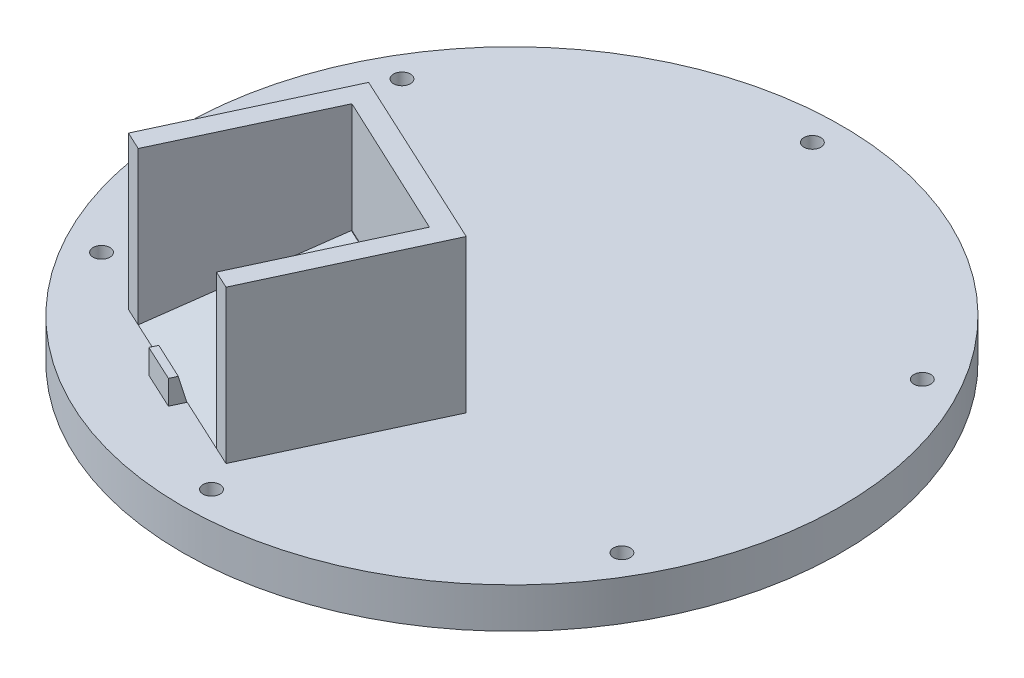
ISO-10303-21;
HEADER;
FILE_DESCRIPTION(('STEP AP214'),'2;1');
FILE_NAME('part.step','',(''),(''),'','','');
FILE_SCHEMA(('AUTOMOTIVE_DESIGN { 1 0 10303 214 1 1 1 1 }'));
ENDSEC;
DATA;
#1=APPLICATION_CONTEXT('core data for automotive mechanical design processes');
#2=APPLICATION_PROTOCOL_DEFINITION('international standard','automotive_design',2000,#1);
#3=PRODUCT_CONTEXT('',#1,'mechanical');
#4=PRODUCT('Part','Part','',(#3));
#5=PRODUCT_RELATED_PRODUCT_CATEGORY('part','',(#4));
#6=PRODUCT_DEFINITION_FORMATION('','',#4);
#7=PRODUCT_DEFINITION_CONTEXT('part definition',#1,'design');
#8=PRODUCT_DEFINITION('design','',#6,#7);
#9=PRODUCT_DEFINITION_SHAPE('','',#8);
#10=(LENGTH_UNIT() NAMED_UNIT(*) SI_UNIT(.MILLI.,.METRE.));
#11=(NAMED_UNIT(*) PLANE_ANGLE_UNIT() SI_UNIT($,.RADIAN.));
#12=(NAMED_UNIT(*) SI_UNIT($,.STERADIAN.) SOLID_ANGLE_UNIT());
#13=UNCERTAINTY_MEASURE_WITH_UNIT(LENGTH_MEASURE(1.E-05),#10,'distance_accuracy_value','');
#14=(GEOMETRIC_REPRESENTATION_CONTEXT(3) GLOBAL_UNCERTAINTY_ASSIGNED_CONTEXT((#13)) GLOBAL_UNIT_ASSIGNED_CONTEXT((#10,
#11,#12)) REPRESENTATION_CONTEXT('',''));
#15=CARTESIAN_POINT('',(0.,0.,0.));
#16=DIRECTION('',(0.,0.,1.));
#17=DIRECTION('',(1.,0.,0.));
#18=AXIS2_PLACEMENT_3D('',#15,#16,#17);
#19=CARTESIAN_POINT('',(-21.7722669193187,16.,59.0206813267031));
#20=DIRECTION('',(-0.421315977260946,0.,0.906913913943685));
#21=DIRECTION('',(0.906913913943685,0.,0.421315977260946));
#22=AXIS2_PLACEMENT_3D('',#19,#20,#21);
#23=PLANE('',#22);
#24=DIRECTION('',(-0.906913683111932,-0.000713476565609425,-0.421315870025734));
#25=VECTOR('',#24,1.);
#26=CARTESIAN_POINT('',(-21.768396146707,10.0179261405849,59.0224795330385));
#27=LINE('',#26,#25);
#28=CARTESIAN_POINT('',(-21.7722669193187,10.0179230954158,59.0206813267031));
#29=VERTEX_POINT('',#28);
#30=CARTESIAN_POINT('',(-30.8821616605973,10.0107562651715,54.7885881294822));
#31=VERTEX_POINT('',#30);
#32=EDGE_CURVE('E339',#29,#31,#27,.T.);
#33=ORIENTED_EDGE('',*,*,#32,.F.);
#34=DIRECTION('',(0.,-1.,0.));
#35=VECTOR('',#34,1.);
#36=CARTESIAN_POINT('',(-21.7722669193187,16.,59.0206813267031));
#37=LINE('',#36,#35);
#38=CARTESIAN_POINT('',(-21.7722669193187,10.,59.0206813267031));
#39=VERTEX_POINT('',#38);
#40=EDGE_CURVE('E62',#29,#39,#37,.T.);
#41=ORIENTED_EDGE('',*,*,#40,.T.);
#42=DIRECTION('',(-0.906913913943685,0.,-0.421315977260946));
#43=VECTOR('',#42,1.);
#44=CARTESIAN_POINT('',(-21.7722669193187,10.,59.0206813267031));
#45=LINE('',#44,#43);
#46=CARTESIAN_POINT('',(-30.8821616605973,10.,54.7885881294822));
#47=VERTEX_POINT('',#46);
#48=EDGE_CURVE('E335',#39,#47,#45,.T.);
#49=ORIENTED_EDGE('',*,*,#48,.T.);
#50=DIRECTION('',(0.,-1.,0.));
#51=VECTOR('',#50,1.);
#52=CARTESIAN_POINT('',(-30.8821616605973,16.,54.7885881294822));
#53=LINE('',#52,#51);
#54=EDGE_CURVE('E191',#31,#47,#53,.T.);
#55=ORIENTED_EDGE('',*,*,#54,.F.);
#56=EDGE_LOOP('',(#33,#41,#49,#55));
#57=FACE_BOUND('',#56,.T.);
#58=ADVANCED_FACE('F39',(#57),#23,.F.);
#59=CARTESIAN_POINT('',(-30.8821616605973,16.,54.7885881294822));
#60=DIRECTION('',(0.906913913943684,0.,0.421315977260948));
#61=DIRECTION('',(0.421315977260949,0.,-0.906913913943684));
#62=AXIS2_PLACEMENT_3D('',#59,#60,#61);
#63=PLANE('',#62);
#64=DIRECTION('',(-0.406933180952735,-0.259056347302405,0.875953877302923));
#65=VECTOR('',#64,1.);
#66=CARTESIAN_POINT('',(-30.2507838305426,10.4126955566266,53.4295004852044));
#67=LINE('',#66,#65);
#68=CARTESIAN_POINT('',(-30.8990579121155,10.,54.824958565028));
#69=VERTEX_POINT('',#68);
#70=EDGE_CURVE('E156',#31,#69,#67,.T.);
#71=ORIENTED_EDGE('',*,*,#70,.F.);
#72=ORIENTED_EDGE('',*,*,#54,.T.);
#73=DIRECTION('',(-0.421315977260949,0.,0.906913913943684));
#74=VECTOR('',#73,1.);
#75=CARTESIAN_POINT('',(-30.8821616605973,10.,54.7885881294822));
#76=LINE('',#75,#74);
#77=EDGE_CURVE('E334',#47,#69,#76,.T.);
#78=ORIENTED_EDGE('',*,*,#77,.T.);
#79=EDGE_LOOP('',(#71,#72,#78));
#80=FACE_BOUND('',#79,.T.);
#81=ADVANCED_FACE('F364',(#80),#63,.F.);
#82=CARTESIAN_POINT('',(-23.2553438736159,16.,62.2131145547178));
#83=DIRECTION('',(-0.906913913943685,0.,-0.421315977260945));
#84=DIRECTION('',(-0.421315977260945,0.,0.906913913943686));
#85=AXIS2_PLACEMENT_3D('',#82,#83,#84);
#86=PLANE('',#85);
#87=DIRECTION('',(0.406933180952732,0.259056347302405,-0.875953877302925));
#88=VECTOR('',#87,1.);
#89=CARTESIAN_POINT('',(-22.5251919831543,9.53860603315755,60.6414084137428));
#90=LINE('',#89,#88);
#91=CARTESIAN_POINT('',(-21.8004210344602,10.,59.0812851493318));
#92=VERTEX_POINT('',#91);
#93=EDGE_CURVE('E11',#92,#29,#90,.T.);
#94=ORIENTED_EDGE('',*,*,#93,.F.);
#95=DIRECTION('',(0.421315977260945,0.,-0.906913913943686));
#96=VECTOR('',#95,1.);
#97=CARTESIAN_POINT('',(-23.2553438736159,10.,62.2131145547178));
#98=LINE('',#97,#96);
#99=EDGE_CURVE('E161',#92,#39,#98,.T.);
#100=ORIENTED_EDGE('',*,*,#99,.T.);
#101=ORIENTED_EDGE('',*,*,#40,.F.);
#102=EDGE_LOOP('',(#94,#100,#101));
#103=FACE_BOUND('',#102,.T.);
#104=ADVANCED_FACE('F160',(#103),#86,.F.);
#105=CARTESIAN_POINT('',(0.,10.,0.));
#106=DIRECTION('',(0.,1.,0.));
#107=DIRECTION('',(0.,0.,1.));
#108=AXIS2_PLACEMENT_3D('',#105,#106,#107);
#109=PLANE('',#108);
#110=CARTESIAN_POINT('',(-32.3652386148944,10.,57.9810213574968));
#111=VERTEX_POINT('',#110);
#112=EDGE_CURVE('E337',#69,#111,#76,.T.);
#113=ORIENTED_EDGE('',*,*,#112,.F.);
#114=ORIENTED_EDGE('',*,*,#77,.F.);
#115=DIRECTION('',(0.906913913943685,0.,0.421315977260946));
#116=VECTOR('',#115,1.);
#117=CARTESIAN_POINT('',(-8.1817279056013,10.,65.3343028711874));
#118=LINE('',#117,#116);
#119=CARTESIAN_POINT('',(-44.5546556617318,10.,48.4368935715794));
#120=VERTEX_POINT('',#119);
#121=EDGE_CURVE('E252',#120,#47,#118,.T.);
#122=ORIENTED_EDGE('',*,*,#121,.F.);
#123=DIRECTION('',(0.906913913943685,0.,0.421315977260946));
#124=VECTOR('',#123,1.);
#125=CARTESIAN_POINT('',(-26.4163773828581,10.,56.8632131167983));
#126=LINE('',#125,#124);
#127=CARTESIAN_POINT('',(-49.0892252314503,10.,46.3303136852747));
#128=VERTEX_POINT('',#127);
#129=EDGE_CURVE('E198',#128,#120,#126,.T.);
#130=ORIENTED_EDGE('',*,*,#129,.F.);
#131=DIRECTION('',(0.421315977260946,0.,-0.906913913943685));
#132=VECTOR('',#131,1.);
#133=CARTESIAN_POINT('',(-22.6728478485921,10.,-10.5328994315236));
#134=LINE('',#133,#132);
#135=CARTESIAN_POINT('',(-30.1300062547077,10.,5.51918755780882));
#136=VERTEX_POINT('',#135);
#137=EDGE_CURVE('E221',#128,#136,#134,.T.);
#138=ORIENTED_EDGE('',*,*,#137,.T.);
#139=DIRECTION('',(0.906913913943684,0.,0.421315977260948));
#140=VECTOR('',#139,1.);
#141=CARTESIAN_POINT('',(-7.45715840611564,10.,16.0520869893325));
#142=LINE('',#141,#140);
#143=CARTESIAN_POINT('',(15.2156894424765,10.,26.5849864208562));
#144=VERTEX_POINT('',#143);
#145=EDGE_CURVE('E219',#136,#144,#142,.T.);
#146=ORIENTED_EDGE('',*,*,#145,.T.);
#147=DIRECTION('',(0.421315977260946,0.,-0.906913913943685));
#148=VECTOR('',#147,1.);
#149=CARTESIAN_POINT('',(22.6728478485921,10.,10.5328994315236));
#150=LINE('',#149,#148);
#151=CARTESIAN_POINT('',(-3.743529534266,10.,67.396112548322));
#152=VERTEX_POINT('',#151);
#153=EDGE_CURVE('E216',#152,#144,#150,.T.);
#154=ORIENTED_EDGE('',*,*,#153,.F.);
#155=CARTESIAN_POINT('',(-8.1817279056013,10.,65.3343028711874));
#156=VERTEX_POINT('',#155);
#157=EDGE_CURVE('E193',#156,#152,#126,.T.);
#158=ORIENTED_EDGE('',*,*,#157,.F.);
#159=EDGE_CURVE('E171',#39,#156,#118,.T.);
#160=ORIENTED_EDGE('',*,*,#159,.F.);
#161=ORIENTED_EDGE('',*,*,#99,.F.);
#162=CARTESIAN_POINT('',(-23.2553438736159,10.,62.2131145547178));
#163=VERTEX_POINT('',#162);
#164=EDGE_CURVE('E169',#163,#92,#98,.T.);
#165=ORIENTED_EDGE('',*,*,#164,.F.);
#166=DIRECTION('',(0.906913913943685,0.,0.421315977260946));
#167=VECTOR('',#166,1.);
#168=CARTESIAN_POINT('',(-32.3652386148944,10.,57.9810213574968));
#169=LINE('',#168,#167);
#170=EDGE_CURVE('E173',#111,#163,#169,.T.);
#171=ORIENTED_EDGE('',*,*,#170,.F.);
#172=EDGE_LOOP('',(#113,#114,#122,#130,#138,#146,#154,#158,#160,#161,#165,#171));
#173=FACE_BOUND('',#172,.T.);
#174=CARTESIAN_POINT('',(-64.7353989328866,10.,37.3750000000003));
#175=DIRECTION('',(0.,1.,0.));
#176=DIRECTION('',(0.,0.,1.));
#177=AXIS2_PLACEMENT_3D('',#174,#175,#176);
#178=CIRCLE('',#177,2.09999999999999);
#179=CARTESIAN_POINT('',(-64.7353989328866,10.,39.4750000000003));
#180=VERTEX_POINT('',#179);
#181=EDGE_CURVE('E275',#180,#180,#178,.T.);
#182=ORIENTED_EDGE('',*,*,#181,.F.);
#183=EDGE_LOOP('',(#182));
#184=FACE_BOUND('',#183,.T.);
#185=CARTESIAN_POINT('',(0.,10.,0.));
#186=DIRECTION('',(0.,1.,0.));
#187=DIRECTION('',(0.,0.,1.));
#188=AXIS2_PLACEMENT_3D('',#185,#186,#187);
#189=CIRCLE('',#188,82.);
#190=CARTESIAN_POINT('',(0.,10.,82.));
#191=VERTEX_POINT('',#190);
#192=EDGE_CURVE('E294',#191,#191,#189,.T.);
#193=ORIENTED_EDGE('',*,*,#192,.T.);
#194=EDGE_LOOP('',(#193));
#195=FACE_BOUND('',#194,.T.);
#196=CARTESIAN_POINT('',(64.7353989328864,10.,-37.3750000000008));
#197=DIRECTION('',(0.,1.,0.));
#198=DIRECTION('',(0.,0.,1.));
#199=AXIS2_PLACEMENT_3D('',#196,#197,#198);
#200=CIRCLE('',#199,2.09999999999999);
#201=CARTESIAN_POINT('',(64.7353989328864,10.,-35.2750000000008));
#202=VERTEX_POINT('',#201);
#203=EDGE_CURVE('E255',#202,#202,#200,.T.);
#204=ORIENTED_EDGE('',*,*,#203,.F.);
#205=EDGE_LOOP('',(#204));
#206=FACE_BOUND('',#205,.T.);
#207=CARTESIAN_POINT('',(64.7353989328871,10.,37.3749999999994));
#208=DIRECTION('',(0.,1.,0.));
#209=DIRECTION('',(0.,0.,1.));
#210=AXIS2_PLACEMENT_3D('',#207,#208,#209);
#211=CIRCLE('',#210,2.09999999999999);
#212=CARTESIAN_POINT('',(64.7353989328871,10.,39.4749999999994));
#213=VERTEX_POINT('',#212);
#214=EDGE_CURVE('E263',#213,#213,#211,.T.);
#215=ORIENTED_EDGE('',*,*,#214,.F.);
#216=EDGE_LOOP('',(#215));
#217=FACE_BOUND('',#216,.T.);
#218=CARTESIAN_POINT('',(0.,10.,74.75));
#219=DIRECTION('',(0.,1.,0.));
#220=DIRECTION('',(0.,0.,1.));
#221=AXIS2_PLACEMENT_3D('',#218,#219,#220);
#222=CIRCLE('',#221,2.09999999999999);
#223=CARTESIAN_POINT('',(0.,10.,76.85));
#224=VERTEX_POINT('',#223);
#225=EDGE_CURVE('E269',#224,#224,#222,.T.);
#226=ORIENTED_EDGE('',*,*,#225,.F.);
#227=EDGE_LOOP('',(#226));
#228=FACE_BOUND('',#227,.T.);
#229=CARTESIAN_POINT('',(-64.7353989328869,10.,-37.3749999999998));
#230=DIRECTION('',(0.,1.,0.));
#231=DIRECTION('',(0.,0.,1.));
#232=AXIS2_PLACEMENT_3D('',#229,#230,#231);
#233=CIRCLE('',#232,2.09999999999999);
#234=CARTESIAN_POINT('',(-64.7353989328869,10.,-35.2749999999999));
#235=VERTEX_POINT('',#234);
#236=EDGE_CURVE('E281',#235,#235,#233,.T.);
#237=ORIENTED_EDGE('',*,*,#236,.F.);
#238=EDGE_LOOP('',(#237));
#239=FACE_BOUND('',#238,.T.);
#240=CARTESIAN_POINT('',(0.,10.,-74.75));
#241=DIRECTION('',(0.,1.,0.));
#242=DIRECTION('',(0.,0.,1.));
#243=AXIS2_PLACEMENT_3D('',#240,#241,#242);
#244=CIRCLE('',#243,2.09999999999999);
#245=CARTESIAN_POINT('',(0.,10.,-72.65));
#246=VERTEX_POINT('',#245);
#247=EDGE_CURVE('E287',#246,#246,#244,.T.);
#248=ORIENTED_EDGE('',*,*,#247,.F.);
#249=EDGE_LOOP('',(#248));
#250=FACE_BOUND('',#249,.T.);
#251=ADVANCED_FACE('F166',(#173,#184,#195,#206,#217,#228,#239,#250),#109,.T.);
#252=CARTESIAN_POINT('',(0.,10.,0.));
#253=DIRECTION('',(0.,-1.,0.));
#254=DIRECTION('',(0.,0.,-1.));
#255=AXIS2_PLACEMENT_3D('',#252,#253,#254);
#256=CYLINDRICAL_SURFACE('',#255,82.);
#257=ORIENTED_EDGE('',*,*,#192,.F.);
#258=EDGE_LOOP('',(#257));
#259=FACE_BOUND('',#258,.T.);
#260=CARTESIAN_POINT('',(0.,0.,0.));
#261=DIRECTION('',(0.,1.,0.));
#262=DIRECTION('',(0.,0.,1.));
#263=AXIS2_PLACEMENT_3D('',#260,#261,#262);
#264=CIRCLE('',#263,82.);
#265=CARTESIAN_POINT('',(0.,0.,82.));
#266=VERTEX_POINT('',#265);
#267=EDGE_CURVE('E293',#266,#266,#264,.T.);
#268=ORIENTED_EDGE('',*,*,#267,.T.);
#269=EDGE_LOOP('',(#268));
#270=FACE_BOUND('',#269,.T.);
#271=ADVANCED_FACE('F41',(#259,#270),#256,.T.);
#272=CARTESIAN_POINT('',(0.,0.,0.));
#273=DIRECTION('',(0.,1.,0.));
#274=DIRECTION('',(0.,0.,1.));
#275=AXIS2_PLACEMENT_3D('',#272,#273,#274);
#276=PLANE('',#275);
#277=CARTESIAN_POINT('',(64.7353989328864,0.,-37.3750000000008));
#278=DIRECTION('',(0.,1.,0.));
#279=DIRECTION('',(0.,0.,1.));
#280=AXIS2_PLACEMENT_3D('',#277,#278,#279);
#281=CIRCLE('',#280,2.09999999999999);
#282=CARTESIAN_POINT('',(64.7353989328864,0.,-35.2750000000008));
#283=VERTEX_POINT('',#282);
#284=EDGE_CURVE('E260',#283,#283,#281,.T.);
#285=ORIENTED_EDGE('',*,*,#284,.T.);
#286=EDGE_LOOP('',(#285));
#287=FACE_BOUND('',#286,.T.);
#288=CARTESIAN_POINT('',(64.7353989328871,0.,37.3749999999994));
#289=DIRECTION('',(0.,1.,0.));
#290=DIRECTION('',(0.,0.,1.));
#291=AXIS2_PLACEMENT_3D('',#288,#289,#290);
#292=CIRCLE('',#291,2.09999999999999);
#293=CARTESIAN_POINT('',(64.7353989328871,0.,39.4749999999994));
#294=VERTEX_POINT('',#293);
#295=EDGE_CURVE('E266',#294,#294,#292,.T.);
#296=ORIENTED_EDGE('',*,*,#295,.T.);
#297=EDGE_LOOP('',(#296));
#298=FACE_BOUND('',#297,.T.);
#299=CARTESIAN_POINT('',(0.,0.,74.75));
#300=DIRECTION('',(0.,1.,0.));
#301=DIRECTION('',(0.,0.,1.));
#302=AXIS2_PLACEMENT_3D('',#299,#300,#301);
#303=CIRCLE('',#302,2.1);
#304=CARTESIAN_POINT('',(0.,0.,76.85));
#305=VERTEX_POINT('',#304);
#306=EDGE_CURVE('E272',#305,#305,#303,.T.);
#307=ORIENTED_EDGE('',*,*,#306,.T.);
#308=EDGE_LOOP('',(#307));
#309=FACE_BOUND('',#308,.T.);
#310=CARTESIAN_POINT('',(-64.7353989328866,0.,37.3750000000003));
#311=DIRECTION('',(0.,1.,0.));
#312=DIRECTION('',(0.,0.,1.));
#313=AXIS2_PLACEMENT_3D('',#310,#311,#312);
#314=CIRCLE('',#313,2.09999999999999);
#315=CARTESIAN_POINT('',(-64.7353989328866,0.,39.4750000000003));
#316=VERTEX_POINT('',#315);
#317=EDGE_CURVE('E278',#316,#316,#314,.T.);
#318=ORIENTED_EDGE('',*,*,#317,.T.);
#319=EDGE_LOOP('',(#318));
#320=FACE_BOUND('',#319,.T.);
#321=CARTESIAN_POINT('',(-64.7353989328869,0.,-37.3749999999998));
#322=DIRECTION('',(0.,1.,0.));
#323=DIRECTION('',(0.,0.,1.));
#324=AXIS2_PLACEMENT_3D('',#321,#322,#323);
#325=CIRCLE('',#324,2.09999999999999);
#326=CARTESIAN_POINT('',(-64.7353989328869,0.,-35.2749999999999));
#327=VERTEX_POINT('',#326);
#328=EDGE_CURVE('E284',#327,#327,#325,.T.);
#329=ORIENTED_EDGE('',*,*,#328,.T.);
#330=EDGE_LOOP('',(#329));
#331=FACE_BOUND('',#330,.T.);
#332=CARTESIAN_POINT('',(0.,0.,-74.75));
#333=DIRECTION('',(0.,1.,0.));
#334=DIRECTION('',(0.,0.,1.));
#335=AXIS2_PLACEMENT_3D('',#332,#333,#334);
#336=CIRCLE('',#335,2.1);
#337=CARTESIAN_POINT('',(0.,0.,-72.65));
#338=VERTEX_POINT('',#337);
#339=EDGE_CURVE('E290',#338,#338,#336,.T.);
#340=ORIENTED_EDGE('',*,*,#339,.T.);
#341=EDGE_LOOP('',(#340));
#342=FACE_BOUND('',#341,.T.);
#343=ORIENTED_EDGE('',*,*,#267,.F.);
#344=EDGE_LOOP('',(#343));
#345=FACE_BOUND('',#344,.T.);
#346=ADVANCED_FACE('F422',(#287,#298,#309,#320,#331,#342,#345),#276,.F.);
#347=CARTESIAN_POINT('',(0.,10.,-74.75));
#348=DIRECTION('',(0.,1.,0.));
#349=DIRECTION('',(0.,0.,1.));
#350=AXIS2_PLACEMENT_3D('',#347,#348,#349);
#351=CYLINDRICAL_SURFACE('',#350,2.09999999999999);
#352=ORIENTED_EDGE('',*,*,#339,.F.);
#353=EDGE_LOOP('',(#352));
#354=FACE_BOUND('',#353,.T.);
#355=ORIENTED_EDGE('',*,*,#247,.T.);
#356=EDGE_LOOP('',(#355));
#357=FACE_BOUND('',#356,.T.);
#358=ADVANCED_FACE('F418',(#354,#357),#351,.F.);
#359=CARTESIAN_POINT('',(-64.7353989328869,10.,-37.3749999999998));
#360=DIRECTION('',(0.,1.,0.));
#361=DIRECTION('',(0.,0.,1.));
#362=AXIS2_PLACEMENT_3D('',#359,#360,#361);
#363=CYLINDRICAL_SURFACE('',#362,2.09999999999999);
#364=ORIENTED_EDGE('',*,*,#328,.F.);
#365=EDGE_LOOP('',(#364));
#366=FACE_BOUND('',#365,.T.);
#367=ORIENTED_EDGE('',*,*,#236,.T.);
#368=EDGE_LOOP('',(#367));
#369=FACE_BOUND('',#368,.T.);
#370=ADVANCED_FACE('F414',(#366,#369),#363,.F.);
#371=CARTESIAN_POINT('',(-64.7353989328866,10.,37.3750000000003));
#372=DIRECTION('',(0.,1.,0.));
#373=DIRECTION('',(0.,0.,1.));
#374=AXIS2_PLACEMENT_3D('',#371,#372,#373);
#375=CYLINDRICAL_SURFACE('',#374,2.09999999999999);
#376=ORIENTED_EDGE('',*,*,#317,.F.);
#377=EDGE_LOOP('',(#376));
#378=FACE_BOUND('',#377,.T.);
#379=ORIENTED_EDGE('',*,*,#181,.T.);
#380=EDGE_LOOP('',(#379));
#381=FACE_BOUND('',#380,.T.);
#382=ADVANCED_FACE('F410',(#378,#381),#375,.F.);
#383=CARTESIAN_POINT('',(0.,10.,74.75));
#384=DIRECTION('',(0.,1.,0.));
#385=DIRECTION('',(0.,0.,1.));
#386=AXIS2_PLACEMENT_3D('',#383,#384,#385);
#387=CYLINDRICAL_SURFACE('',#386,2.09999999999999);
#388=ORIENTED_EDGE('',*,*,#306,.F.);
#389=EDGE_LOOP('',(#388));
#390=FACE_BOUND('',#389,.T.);
#391=ORIENTED_EDGE('',*,*,#225,.T.);
#392=EDGE_LOOP('',(#391));
#393=FACE_BOUND('',#392,.T.);
#394=ADVANCED_FACE('F406',(#390,#393),#387,.F.);
#395=CARTESIAN_POINT('',(64.7353989328871,10.,37.3749999999994));
#396=DIRECTION('',(0.,1.,0.));
#397=DIRECTION('',(0.,0.,1.));
#398=AXIS2_PLACEMENT_3D('',#395,#396,#397);
#399=CYLINDRICAL_SURFACE('',#398,2.09999999999999);
#400=ORIENTED_EDGE('',*,*,#295,.F.);
#401=EDGE_LOOP('',(#400));
#402=FACE_BOUND('',#401,.T.);
#403=ORIENTED_EDGE('',*,*,#214,.T.);
#404=EDGE_LOOP('',(#403));
#405=FACE_BOUND('',#404,.T.);
#406=ADVANCED_FACE('F402',(#402,#405),#399,.F.);
#407=CARTESIAN_POINT('',(64.7353989328864,10.,-37.3750000000008));
#408=DIRECTION('',(0.,1.,0.));
#409=DIRECTION('',(0.,0.,1.));
#410=AXIS2_PLACEMENT_3D('',#407,#408,#409);
#411=CYLINDRICAL_SURFACE('',#410,2.09999999999999);
#412=ORIENTED_EDGE('',*,*,#284,.F.);
#413=EDGE_LOOP('',(#412));
#414=FACE_BOUND('',#413,.T.);
#415=ORIENTED_EDGE('',*,*,#203,.T.);
#416=EDGE_LOOP('',(#415));
#417=FACE_BOUND('',#416,.T.);
#418=ADVANCED_FACE('F399',(#414,#417),#411,.F.);
#419=CARTESIAN_POINT('',(0.,20.7,0.));
#420=DIRECTION('',(0.,1.,0.));
#421=DIRECTION('',(0.,0.,1.));
#422=AXIS2_PLACEMENT_3D('',#419,#420,#421);
#423=PLANE('',#422);
#424=DIRECTION('',(-0.906913913943685,0.,-0.421315977260946));
#425=VECTOR('',#424,1.);
#426=CARTESIAN_POINT('',(-9.60862775399264,20.7,20.6832844570814));
#427=LINE('',#426,#425);
#428=CARTESIAN_POINT('',(8.62602172326418,20.7,29.1543742114705));
#429=VERTEX_POINT('',#428);
#430=CARTESIAN_POINT('',(-27.6506631847611,20.7,12.3016754946206));
#431=VERTEX_POINT('',#430);
#432=EDGE_CURVE('E297',#429,#431,#427,.T.);
#433=ORIENTED_EDGE('',*,*,#432,.F.);
#434=DIRECTION('',(-0.905789959313811,0.,-0.423726975311089));
#435=VECTOR('',#434,1.);
#436=CARTESIAN_POINT('',(-27.6055766492883,20.7,12.2052951990269));
#437=LINE('',#436,#435);
#438=CARTESIAN_POINT('',(-27.6055766492883,20.7,12.2052951990269));
#439=VERTEX_POINT('',#438);
#440=EDGE_CURVE('E249',#429,#439,#437,.T.);
#441=ORIENTED_EDGE('',*,*,#440,.T.);
#442=DIRECTION('',(-0.423726975311089,0.,0.905789959313811));
#443=VECTOR('',#442,1.);
#444=CARTESIAN_POINT('',(-44.5546556617318,20.7,48.4368935715794));
#445=LINE('',#444,#443);
#446=EDGE_CURVE('E251',#439,#431,#445,.T.);
#447=ORIENTED_EDGE('',*,*,#446,.T.);
#448=EDGE_LOOP('',(#433,#441,#447));
#449=FACE_BOUND('',#448,.T.);
#450=ADVANCED_FACE('F309',(#449),#423,.T.);
#451=CARTESIAN_POINT('',(-125.192771261308,10.,10.9756461963118));
#452=DIRECTION('',(0.109145298628935,-0.965861751435545,-0.234943356792787));
#453=DIRECTION('',(0.,0.236355389649188,-0.971666676275244));
#454=AXIS2_PLACEMENT_3D('',#451,#452,#453);
#455=PLANE('',#454);
#456=ORIENTED_EDGE('',*,*,#121,.T.);
#457=ORIENTED_EDGE('',*,*,#48,.F.);
#458=ORIENTED_EDGE('',*,*,#159,.T.);
#459=DIRECTION('',(0.406932987705035,0.259058057419301,-0.875953461322913));
#460=VECTOR('',#459,1.);
#461=CARTESIAN_POINT('',(-8.1817279056013,10.,65.3343028711874));
#462=LINE('',#461,#460);
#463=EDGE_CURVE('E245',#156,#429,#462,.T.);
#464=ORIENTED_EDGE('',*,*,#463,.T.);
#465=ORIENTED_EDGE('',*,*,#432,.T.);
#466=DIRECTION('',(0.409261775681546,0.259057202359645,-0.87486808426847));
#467=VECTOR('',#466,1.);
#468=CARTESIAN_POINT('',(-43.4202180078752,10.7180837848101,46.011836173295));
#469=LINE('',#468,#467);
#470=EDGE_CURVE('E247',#120,#431,#469,.T.);
#471=ORIENTED_EDGE('',*,*,#470,.F.);
#472=EDGE_LOOP('',(#456,#457,#458,#464,#465,#471));
#473=FACE_BOUND('',#472,.T.);
#474=ADVANCED_FACE('F304',(#473),#455,.F.);
#475=CARTESIAN_POINT('',(18.2346494772568,48.,8.47108975438908));
#476=DIRECTION('',(0.906913913943685,0.,0.421315977260946));
#477=DIRECTION('',(0.421315977260946,0.,-0.906913913943685));
#478=AXIS2_PLACEMENT_3D('',#475,#476,#477);
#479=PLANE('',#478);
#480=DIRECTION('',(0.,-1.,0.));
#481=VECTOR('',#480,1.);
#482=CARTESIAN_POINT('',(8.62602172326418,48.,29.1543742114705));
#483=LINE('',#482,#481);
#484=CARTESIAN_POINT('',(8.62602172326418,48.,29.1543742114705));
#485=VERTEX_POINT('',#484);
#486=EDGE_CURVE('E242',#485,#429,#483,.T.);
#487=ORIENTED_EDGE('',*,*,#486,.T.);
#488=ORIENTED_EDGE('',*,*,#463,.F.);
#489=DIRECTION('',(0.,-1.,0.));
#490=VECTOR('',#489,1.);
#491=CARTESIAN_POINT('',(-8.18172790560131,48.,65.3343028711874));
#492=LINE('',#491,#490);
#493=CARTESIAN_POINT('',(-8.18172790560131,48.,65.3343028711874));
#494=VERTEX_POINT('',#493);
#495=EDGE_CURVE('E239',#494,#156,#492,.T.);
#496=ORIENTED_EDGE('',*,*,#495,.F.);
#497=DIRECTION('',(-0.421315977260946,0.,0.906913913943685));
#498=VECTOR('',#497,1.);
#499=CARTESIAN_POINT('',(18.2346494772568,48.,8.47108975438908));
#500=LINE('',#499,#498);
#501=EDGE_CURVE('E197',#485,#494,#500,.T.);
#502=ORIENTED_EDGE('',*,*,#501,.F.);
#503=EDGE_LOOP('',(#487,#488,#496,#502));
#504=FACE_BOUND('',#503,.T.);
#505=ADVANCED_FACE('F317',(#504),#479,.F.);
#506=CARTESIAN_POINT('',(-9.64091636863042,48.,20.6091321867774));
#507=DIRECTION('',(0.423726975311089,0.,-0.905789959313811));
#508=DIRECTION('',(-0.905789959313811,0.,-0.423726975311089));
#509=AXIS2_PLACEMENT_3D('',#506,#507,#508);
#510=PLANE('',#509);
#511=ORIENTED_EDGE('',*,*,#440,.F.);
#512=ORIENTED_EDGE('',*,*,#486,.F.);
#513=DIRECTION('',(0.905789959313811,0.,0.423726975311089));
#514=VECTOR('',#513,1.);
#515=CARTESIAN_POINT('',(-9.64091636863042,48.,20.6091321867774));
#516=LINE('',#515,#514);
#517=CARTESIAN_POINT('',(-27.6055766492883,48.,12.2052951990269));
#518=VERTEX_POINT('',#517);
#519=EDGE_CURVE('E194',#518,#485,#516,.T.);
#520=ORIENTED_EDGE('',*,*,#519,.F.);
#521=DIRECTION('',(0.,-1.,0.));
#522=VECTOR('',#521,1.);
#523=CARTESIAN_POINT('',(-27.6055766492883,48.,12.2052951990269));
#524=LINE('',#523,#522);
#525=EDGE_CURVE('E213',#518,#439,#524,.T.);
#526=ORIENTED_EDGE('',*,*,#525,.T.);
#527=EDGE_LOOP('',(#511,#512,#520,#526));
#528=FACE_BOUND('',#527,.T.);
#529=ADVANCED_FACE('F313',(#528),#510,.F.);
#530=CARTESIAN_POINT('',(-26.4163773828581,48.,56.8632131167983));
#531=DIRECTION('',(0.421315977260946,0.,-0.906913913943685));
#532=DIRECTION('',(-0.906913913943685,0.,-0.421315977260946));
#533=AXIS2_PLACEMENT_3D('',#530,#531,#532);
#534=PLANE('',#533);
#535=ORIENTED_EDGE('',*,*,#157,.T.);
#536=DIRECTION('',(0.,-1.,0.));
#537=VECTOR('',#536,1.);
#538=CARTESIAN_POINT('',(-3.74352953426599,48.,67.396112548322));
#539=LINE('',#538,#537);
#540=CARTESIAN_POINT('',(-3.74352953426599,48.,67.396112548322));
#541=VERTEX_POINT('',#540);
#542=EDGE_CURVE('E236',#541,#152,#539,.T.);
#543=ORIENTED_EDGE('',*,*,#542,.F.);
#544=DIRECTION('',(0.906913913943685,0.,0.421315977260946));
#545=VECTOR('',#544,1.);
#546=CARTESIAN_POINT('',(-26.4163773828581,48.,56.8632131167983));
#547=LINE('',#546,#545);
#548=EDGE_CURVE('E200',#494,#541,#547,.T.);
#549=ORIENTED_EDGE('',*,*,#548,.F.);
#550=ORIENTED_EDGE('',*,*,#495,.T.);
#551=EDGE_LOOP('',(#535,#543,#549,#550));
#552=FACE_BOUND('',#551,.T.);
#553=ADVANCED_FACE('F379',(#552),#534,.F.);
#554=CARTESIAN_POINT('',(22.6728478485921,48.,10.5328994315236));
#555=DIRECTION('',(-0.906913913943685,0.,-0.421315977260946));
#556=DIRECTION('',(-0.421315977260946,0.,0.906913913943685));
#557=AXIS2_PLACEMENT_3D('',#554,#555,#556);
#558=PLANE('',#557);
#559=ORIENTED_EDGE('',*,*,#153,.T.);
#560=DIRECTION('',(0.,-1.,0.));
#561=VECTOR('',#560,1.);
#562=CARTESIAN_POINT('',(15.2156894424765,48.,26.5849864208562));
#563=LINE('',#562,#561);
#564=CARTESIAN_POINT('',(15.2156894424765,48.,26.5849864208562));
#565=VERTEX_POINT('',#564);
#566=EDGE_CURVE('E233',#565,#144,#563,.T.);
#567=ORIENTED_EDGE('',*,*,#566,.F.);
#568=DIRECTION('',(0.421315977260946,0.,-0.906913913943685));
#569=VECTOR('',#568,1.);
#570=CARTESIAN_POINT('',(22.6728478485921,48.,10.5328994315236));
#571=LINE('',#570,#569);
#572=EDGE_CURVE('E202',#541,#565,#571,.T.);
#573=ORIENTED_EDGE('',*,*,#572,.F.);
#574=ORIENTED_EDGE('',*,*,#542,.T.);
#575=EDGE_LOOP('',(#559,#567,#573,#574));
#576=FACE_BOUND('',#575,.T.);
#577=ADVANCED_FACE('F386',(#576),#558,.F.);
#578=CARTESIAN_POINT('',(-7.45715840611564,48.,16.0520869893325));
#579=DIRECTION('',(0.421315977260948,0.,-0.906913913943684));
#580=DIRECTION('',(-0.906913913943684,0.,-0.421315977260948));
#581=AXIS2_PLACEMENT_3D('',#578,#579,#580);
#582=PLANE('',#581);
#583=ORIENTED_EDGE('',*,*,#145,.F.);
#584=DIRECTION('',(0.,-1.,0.));
#585=VECTOR('',#584,1.);
#586=CARTESIAN_POINT('',(-30.1300062547077,48.,5.51918755780881));
#587=LINE('',#586,#585);
#588=CARTESIAN_POINT('',(-30.1300062547077,48.,5.51918755780881));
#589=VERTEX_POINT('',#588);
#590=EDGE_CURVE('E230',#589,#136,#587,.T.);
#591=ORIENTED_EDGE('',*,*,#590,.F.);
#592=DIRECTION('',(0.906913913943684,0.,0.421315977260948));
#593=VECTOR('',#592,1.);
#594=CARTESIAN_POINT('',(-7.45715840611564,48.,16.0520869893325));
#595=LINE('',#594,#593);
#596=EDGE_CURVE('E205',#589,#565,#595,.T.);
#597=ORIENTED_EDGE('',*,*,#596,.T.);
#598=ORIENTED_EDGE('',*,*,#566,.T.);
#599=EDGE_LOOP('',(#583,#591,#597,#598));
#600=FACE_BOUND('',#599,.T.);
#601=ADVANCED_FACE('F382',(#600),#582,.T.);
#602=CARTESIAN_POINT('',(-22.6728478485921,48.,-10.5328994315236));
#603=DIRECTION('',(-0.906913913943685,0.,-0.421315977260946));
#604=DIRECTION('',(-0.421315977260946,0.,0.906913913943685));
#605=AXIS2_PLACEMENT_3D('',#602,#603,#604);
#606=PLANE('',#605);
#607=ORIENTED_EDGE('',*,*,#137,.F.);
#608=DIRECTION('',(0.,-1.,0.));
#609=VECTOR('',#608,1.);
#610=CARTESIAN_POINT('',(-49.0892252314503,48.,46.3303136852747));
#611=LINE('',#610,#609);
#612=CARTESIAN_POINT('',(-49.0892252314503,48.,46.3303136852747));
#613=VERTEX_POINT('',#612);
#614=EDGE_CURVE('E227',#613,#128,#611,.T.);
#615=ORIENTED_EDGE('',*,*,#614,.F.);
#616=DIRECTION('',(0.421315977260946,0.,-0.906913913943685));
#617=VECTOR('',#616,1.);
#618=CARTESIAN_POINT('',(-22.6728478485921,48.,-10.5328994315236));
#619=LINE('',#618,#617);
#620=EDGE_CURVE('E208',#613,#589,#619,.T.);
#621=ORIENTED_EDGE('',*,*,#620,.T.);
#622=ORIENTED_EDGE('',*,*,#590,.T.);
#623=EDGE_LOOP('',(#607,#615,#621,#622));
#624=FACE_BOUND('',#623,.T.);
#625=ADVANCED_FACE('F378',(#624),#606,.T.);
#626=ORIENTED_EDGE('',*,*,#129,.T.);
#627=DIRECTION('',(0.,-1.,0.));
#628=VECTOR('',#627,1.);
#629=CARTESIAN_POINT('',(-44.5546556617318,48.,48.4368935715794));
#630=LINE('',#629,#628);
#631=CARTESIAN_POINT('',(-44.5546556617318,48.,48.4368935715794));
#632=VERTEX_POINT('',#631);
#633=EDGE_CURVE('E225',#632,#120,#630,.T.);
#634=ORIENTED_EDGE('',*,*,#633,.F.);
#635=EDGE_CURVE('E203',#613,#632,#547,.T.);
#636=ORIENTED_EDGE('',*,*,#635,.F.);
#637=ORIENTED_EDGE('',*,*,#614,.T.);
#638=EDGE_LOOP('',(#626,#634,#636,#637));
#639=FACE_BOUND('',#638,.T.);
#640=ADVANCED_FACE('F330',(#639),#534,.F.);
#641=CARTESIAN_POINT('',(-17.9646602806579,48.,-8.40383698775048));
#642=DIRECTION('',(-0.905789959313811,0.,-0.423726975311089));
#643=DIRECTION('',(-0.423726975311089,0.,0.905789959313811));
#644=AXIS2_PLACEMENT_3D('',#641,#642,#643);
#645=PLANE('',#644);
#646=ORIENTED_EDGE('',*,*,#470,.T.);
#647=ORIENTED_EDGE('',*,*,#446,.F.);
#648=ORIENTED_EDGE('',*,*,#525,.F.);
#649=DIRECTION('',(0.423726975311089,0.,-0.905789959313811));
#650=VECTOR('',#649,1.);
#651=CARTESIAN_POINT('',(-17.9646602806579,48.,-8.40383698775048));
#652=LINE('',#651,#650);
#653=EDGE_CURVE('E211',#632,#518,#652,.T.);
#654=ORIENTED_EDGE('',*,*,#653,.F.);
#655=ORIENTED_EDGE('',*,*,#633,.T.);
#656=EDGE_LOOP('',(#646,#647,#648,#654,#655));
#657=FACE_BOUND('',#656,.T.);
#658=ADVANCED_FACE('F327',(#657),#645,.F.);
#659=CARTESIAN_POINT('',(0.,48.,0.));
#660=DIRECTION('',(0.,1.,0.));
#661=DIRECTION('',(0.,0.,1.));
#662=AXIS2_PLACEMENT_3D('',#659,#660,#661);
#663=PLANE('',#662);
#664=ORIENTED_EDGE('',*,*,#519,.T.);
#665=ORIENTED_EDGE('',*,*,#501,.T.);
#666=ORIENTED_EDGE('',*,*,#548,.T.);
#667=ORIENTED_EDGE('',*,*,#572,.T.);
#668=ORIENTED_EDGE('',*,*,#596,.F.);
#669=ORIENTED_EDGE('',*,*,#620,.F.);
#670=ORIENTED_EDGE('',*,*,#635,.T.);
#671=ORIENTED_EDGE('',*,*,#653,.T.);
#672=EDGE_LOOP('',(#664,#665,#666,#667,#668,#669,#670,#671));
#673=FACE_BOUND('',#672,.T.);
#674=ADVANCED_FACE('F321',(#673),#663,.T.);
#675=DIRECTION('',(-0.421315977260949,0.,0.906913913943684));
#676=VECTOR('',#675,1.);
#677=CARTESIAN_POINT('',(-30.8821616605973,16.,54.7885881294822));
#678=LINE('',#677,#676);
#679=CARTESIAN_POINT('',(-31.5770760558098,16.,56.284442946371));
#680=VERTEX_POINT('',#679);
#681=CARTESIAN_POINT('',(-32.3652386148944,16.,57.9810213574968));
#682=VERTEX_POINT('',#681);
#683=EDGE_CURVE('E179',#680,#682,#678,.T.);
#684=ORIENTED_EDGE('',*,*,#683,.F.);
#685=DIRECTION('',(0.109145298628937,-0.965861751435544,-0.23494335679279));
#686=VECTOR('',#685,1.);
#687=CARTESIAN_POINT('',(-31.5304396022452,15.587299065681,56.1840545184036));
#688=LINE('',#687,#686);
#689=EDGE_CURVE('E54',#680,#69,#688,.T.);
#690=ORIENTED_EDGE('',*,*,#689,.T.);
#691=ORIENTED_EDGE('',*,*,#112,.T.);
#692=DIRECTION('',(0.,-1.,0.));
#693=VECTOR('',#692,1.);
#694=CARTESIAN_POINT('',(-32.3652386148944,16.,57.9810213574968));
#695=LINE('',#694,#693);
#696=EDGE_CURVE('E188',#682,#111,#695,.T.);
#697=ORIENTED_EDGE('',*,*,#696,.F.);
#698=EDGE_LOOP('',(#684,#690,#691,#697));
#699=FACE_BOUND('',#698,.T.);
#700=ADVANCED_FACE('F350',(#699),#63,.F.);
#701=CARTESIAN_POINT('',(-32.3652386148944,16.,57.9810213574968));
#702=DIRECTION('',(0.421315977260946,0.,-0.906913913943685));
#703=DIRECTION('',(-0.906913913943686,0.,-0.421315977260946));
#704=AXIS2_PLACEMENT_3D('',#701,#702,#703);
#705=PLANE('',#704);
#706=ORIENTED_EDGE('',*,*,#170,.T.);
#707=DIRECTION('',(0.,-1.,0.));
#708=VECTOR('',#707,1.);
#709=CARTESIAN_POINT('',(-23.2553438736159,16.,62.2131145547178));
#710=LINE('',#709,#708);
#711=CARTESIAN_POINT('',(-23.2553438736159,16.,62.2131145547178));
#712=VERTEX_POINT('',#711);
#713=EDGE_CURVE('E178',#712,#163,#710,.T.);
#714=ORIENTED_EDGE('',*,*,#713,.F.);
#715=DIRECTION('',(0.906913913943685,0.,0.421315977260946));
#716=VECTOR('',#715,1.);
#717=CARTESIAN_POINT('',(-32.3652386148944,16.,57.9810213574968));
#718=LINE('',#717,#716);
#719=EDGE_CURVE('E180',#682,#712,#718,.T.);
#720=ORIENTED_EDGE('',*,*,#719,.F.);
#721=ORIENTED_EDGE('',*,*,#696,.T.);
#722=EDGE_LOOP('',(#706,#714,#720,#721));
#723=FACE_BOUND('',#722,.T.);
#724=ADVANCED_FACE('F345',(#723),#705,.F.);
#725=ORIENTED_EDGE('',*,*,#164,.T.);
#726=DIRECTION('',(-0.109145298628937,0.965861751435544,0.23494335679279));
#727=VECTOR('',#726,1.);
#728=CARTESIAN_POINT('',(-22.5305780890817,16.4613939442076,60.6530024065443));
#729=LINE('',#728,#727);
#730=CARTESIAN_POINT('',(-22.4784391781545,16.,60.5407695306748));
#731=VERTEX_POINT('',#730);
#732=EDGE_CURVE('E143',#92,#731,#729,.T.);
#733=ORIENTED_EDGE('',*,*,#732,.T.);
#734=DIRECTION('',(0.421315977260945,0.,-0.906913913943686));
#735=VECTOR('',#734,1.);
#736=CARTESIAN_POINT('',(-23.2553438736159,16.,62.2131145547178));
#737=LINE('',#736,#735);
#738=EDGE_CURVE('E186',#712,#731,#737,.T.);
#739=ORIENTED_EDGE('',*,*,#738,.F.);
#740=ORIENTED_EDGE('',*,*,#713,.T.);
#741=EDGE_LOOP('',(#725,#733,#739,#740));
#742=FACE_BOUND('',#741,.T.);
#743=ADVANCED_FACE('F176',(#742),#86,.F.);
#744=CARTESIAN_POINT('',(0.,16.,0.));
#745=DIRECTION('',(0.,1.,0.));
#746=DIRECTION('',(0.,0.,1.));
#747=AXIS2_PLACEMENT_3D('',#744,#745,#746);
#748=PLANE('',#747);
#749=DIRECTION('',(0.905789959313811,0.,0.423726975311089));
#750=VECTOR('',#749,1.);
#751=CARTESIAN_POINT('',(-27.2718910989304,16.,58.2984010181907));
#752=LINE('',#751,#750);
#753=EDGE_CURVE('E47',#680,#731,#752,.T.);
#754=ORIENTED_EDGE('',*,*,#753,.F.);
#755=ORIENTED_EDGE('',*,*,#683,.T.);
#756=ORIENTED_EDGE('',*,*,#719,.T.);
#757=ORIENTED_EDGE('',*,*,#738,.T.);
#758=EDGE_LOOP('',(#754,#755,#756,#757));
#759=FACE_BOUND('',#758,.T.);
#760=ADVANCED_FACE('F354',(#759),#748,.T.);
#761=CARTESIAN_POINT('',(6.36434494175727,25.0304568499862,10.3889985252514));
#762=DIRECTION('',(-0.109769524788405,0.965861980774476,0.234651412785293));
#763=DIRECTION('',(0.,-0.236078016374884,0.97173410467293));
#764=AXIS2_PLACEMENT_3D('',#761,#762,#763);
#765=PLANE('',#764);
#766=ORIENTED_EDGE('',*,*,#70,.T.);
#767=DIRECTION('',(-0.905789959313811,0.,-0.423726975311089));
#768=VECTOR('',#767,1.);
#769=CARTESIAN_POINT('',(-17.3809568823175,10.,61.148702830912));
#770=LINE('',#769,#768);
#771=EDGE_CURVE('E146',#92,#69,#770,.T.);
#772=ORIENTED_EDGE('',*,*,#771,.F.);
#773=ORIENTED_EDGE('',*,*,#93,.T.);
#774=ORIENTED_EDGE('',*,*,#32,.T.);
#775=EDGE_LOOP('',(#766,#772,#773,#774));
#776=FACE_BOUND('',#775,.T.);
#777=ADVANCED_FACE('F154',(#776),#765,.T.);
#778=CARTESIAN_POINT('',(-14.5362633253182,-15.0304568499863,55.0676765772427));
#779=DIRECTION('',(-0.409261775681545,-0.259057202359649,0.874868084268469));
#780=DIRECTION('',(0.905789959313811,0.,0.423726975311089));
#781=AXIS2_PLACEMENT_3D('',#778,#779,#780);
#782=PLANE('',#781);
#783=ORIENTED_EDGE('',*,*,#753,.T.);
#784=ORIENTED_EDGE('',*,*,#732,.F.);
#785=ORIENTED_EDGE('',*,*,#771,.T.);
#786=ORIENTED_EDGE('',*,*,#689,.F.);
#787=EDGE_LOOP('',(#783,#784,#785,#786));
#788=FACE_BOUND('',#787,.T.);
#789=ADVANCED_FACE('F145',(#788),#782,.F.);
#790=CLOSED_SHELL('',(#58,#81,#104,#251,#271,#346,#358,#370,#382,#394,#406,#418,#450,#474,#505,
#529,#553,#577,#601,#625,#640,#658,#674,#700,#724,#743,#760,#777,#789));
#791=MANIFOLD_SOLID_BREP('B2',#790);
#792=ADVANCED_BREP_SHAPE_REPRESENTATION('',(#18,#791),#14);
#793=SHAPE_DEFINITION_REPRESENTATION(#9,#792);
ENDSEC;
END-ISO-10303-21;
